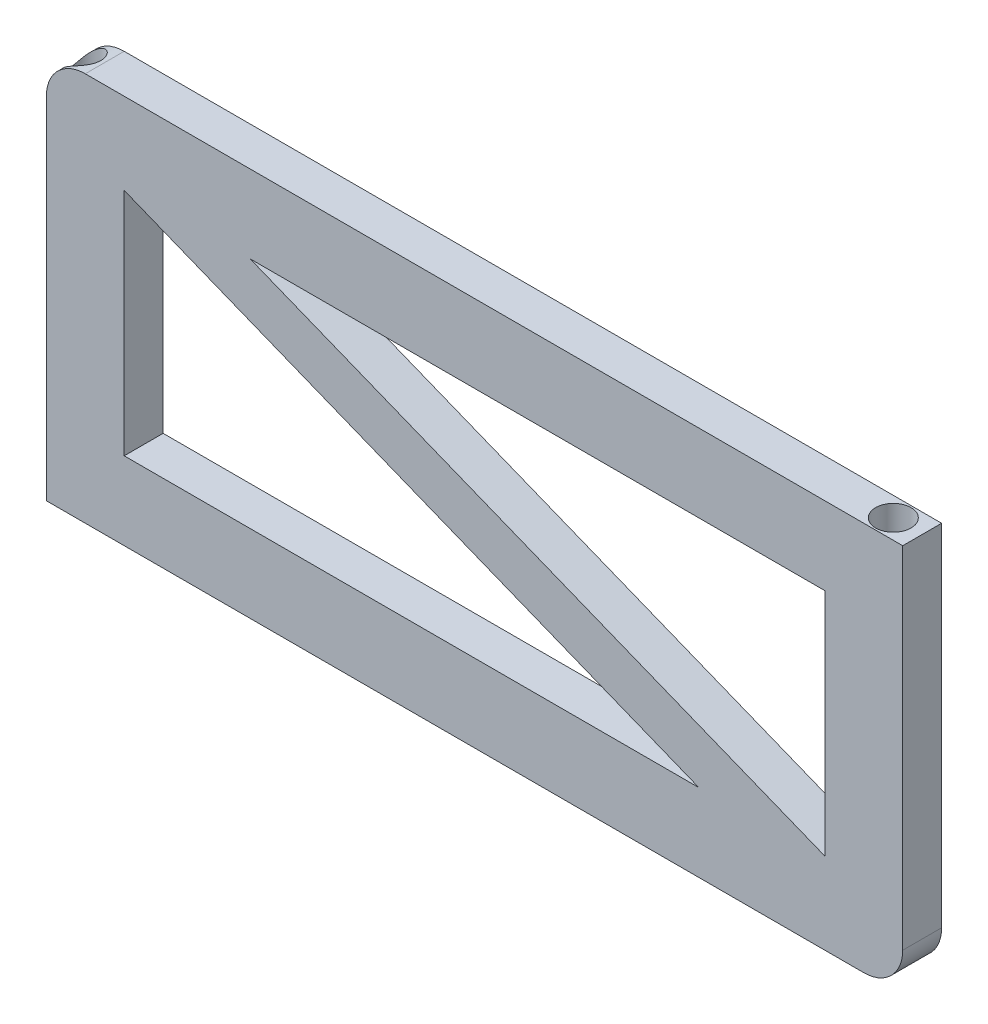
ISO-10303-21;
HEADER;
FILE_DESCRIPTION(('STEP AP214'),'2;1');
FILE_NAME('part.step','',(''),(''),'','','');
FILE_SCHEMA(('AUTOMOTIVE_DESIGN { 1 0 10303 214 1 1 1 1 }'));
ENDSEC;
DATA;
#1=APPLICATION_CONTEXT('core data for automotive mechanical design processes');
#2=APPLICATION_PROTOCOL_DEFINITION('international standard','automotive_design',2000,#1);
#3=PRODUCT_CONTEXT('',#1,'mechanical');
#4=PRODUCT('Part','Part','',(#3));
#5=PRODUCT_RELATED_PRODUCT_CATEGORY('part','',(#4));
#6=PRODUCT_DEFINITION_FORMATION('','',#4);
#7=PRODUCT_DEFINITION_CONTEXT('part definition',#1,'design');
#8=PRODUCT_DEFINITION('design','',#6,#7);
#9=PRODUCT_DEFINITION_SHAPE('','',#8);
#10=(LENGTH_UNIT() NAMED_UNIT(*) SI_UNIT(.MILLI.,.METRE.));
#11=(NAMED_UNIT(*) PLANE_ANGLE_UNIT() SI_UNIT($,.RADIAN.));
#12=(NAMED_UNIT(*) SI_UNIT($,.STERADIAN.) SOLID_ANGLE_UNIT());
#13=UNCERTAINTY_MEASURE_WITH_UNIT(LENGTH_MEASURE(1.E-05),#10,'distance_accuracy_value','');
#14=(GEOMETRIC_REPRESENTATION_CONTEXT(3) GLOBAL_UNCERTAINTY_ASSIGNED_CONTEXT((#13)) GLOBAL_UNIT_ASSIGNED_CONTEXT((#10,
#11,#12)) REPRESENTATION_CONTEXT('',''));
#15=CARTESIAN_POINT('',(0.,0.,0.));
#16=DIRECTION('',(0.,0.,1.));
#17=DIRECTION('',(1.,0.,0.));
#18=AXIS2_PLACEMENT_3D('',#15,#16,#17);
#19=CARTESIAN_POINT('',(200.,0.,10.));
#20=DIRECTION('',(0.,0.,1.));
#21=DIRECTION('',(1.,0.,0.));
#22=AXIS2_PLACEMENT_3D('',#19,#20,#21);
#23=PLANE('',#22);
#24=DIRECTION('',(-1.,0.,0.));
#25=VECTOR('',#24,1.);
#26=CARTESIAN_POINT('',(42.3606797749979,70.,10.));
#27=LINE('',#26,#25);
#28=CARTESIAN_POINT('',(190.,70.,10.));
#29=VERTEX_POINT('',#28);
#30=CARTESIAN_POINT('',(42.3606797749979,70.,10.));
#31=VERTEX_POINT('',#30);
#32=EDGE_CURVE('E168',#29,#31,#27,.T.);
#33=ORIENTED_EDGE('',*,*,#32,.F.);
#34=DIRECTION('',(0.,1.,0.));
#35=VECTOR('',#34,1.);
#36=CARTESIAN_POINT('',(190.,10.9442719099992,10.));
#37=LINE('',#36,#35);
#38=CARTESIAN_POINT('',(190.,10.9442719099992,10.));
#39=VERTEX_POINT('',#38);
#40=EDGE_CURVE('E166',#39,#29,#37,.T.);
#41=ORIENTED_EDGE('',*,*,#40,.F.);
#42=DIRECTION('',(0.928476690885259,-0.371390676354104,0.));
#43=VECTOR('',#42,1.);
#44=CARTESIAN_POINT('',(42.3606797749979,70.,10.));
#45=LINE('',#44,#43);
#46=EDGE_CURVE('E172',#31,#39,#45,.T.);
#47=ORIENTED_EDGE('',*,*,#46,.F.);
#48=EDGE_LOOP('',(#33,#41,#47));
#49=FACE_BOUND('',#48,.T.);
#50=DIRECTION('',(1.,0.,0.));
#51=VECTOR('',#50,1.);
#52=CARTESIAN_POINT('',(-10.,-10.,10.));
#53=LINE('',#52,#51);
#54=CARTESIAN_POINT('',(-10.,-10.,10.));
#55=VERTEX_POINT('',#54);
#56=CARTESIAN_POINT('',(200.,-10.,10.));
#57=VERTEX_POINT('',#56);
#58=EDGE_CURVE('E190',#55,#57,#53,.T.);
#59=ORIENTED_EDGE('',*,*,#58,.T.);
#60=CARTESIAN_POINT('',(200.,0.,10.));
#61=DIRECTION('',(0.,0.,1.));
#62=DIRECTION('',(1.,0.,0.));
#63=AXIS2_PLACEMENT_3D('',#60,#61,#62);
#64=CIRCLE('',#63,10.);
#65=CARTESIAN_POINT('',(210.,0.,10.));
#66=VERTEX_POINT('',#65);
#67=EDGE_CURVE('E193',#57,#66,#64,.T.);
#68=ORIENTED_EDGE('',*,*,#67,.T.);
#69=DIRECTION('',(0.,1.,0.));
#70=VECTOR('',#69,1.);
#71=CARTESIAN_POINT('',(210.,0.,10.));
#72=LINE('',#71,#70);
#73=CARTESIAN_POINT('',(210.,90.,10.));
#74=VERTEX_POINT('',#73);
#75=EDGE_CURVE('E196',#66,#74,#72,.T.);
#76=ORIENTED_EDGE('',*,*,#75,.T.);
#77=DIRECTION('',(-1.,0.,0.));
#78=VECTOR('',#77,1.);
#79=CARTESIAN_POINT('',(0.,90.,10.));
#80=LINE('',#79,#78);
#81=CARTESIAN_POINT('',(0.,90.,10.));
#82=VERTEX_POINT('',#81);
#83=EDGE_CURVE('E198',#74,#82,#80,.T.);
#84=ORIENTED_EDGE('',*,*,#83,.T.);
#85=CARTESIAN_POINT('',(0.,80.,10.));
#86=DIRECTION('',(0.,0.,1.));
#87=DIRECTION('',(-1.,0.,0.));
#88=AXIS2_PLACEMENT_3D('',#85,#86,#87);
#89=CIRCLE('',#88,10.);
#90=CARTESIAN_POINT('',(-10.,80.,10.));
#91=VERTEX_POINT('',#90);
#92=EDGE_CURVE('E200',#82,#91,#89,.T.);
#93=ORIENTED_EDGE('',*,*,#92,.T.);
#94=DIRECTION('',(0.,-1.,0.));
#95=VECTOR('',#94,1.);
#96=CARTESIAN_POINT('',(-10.,-10.,10.));
#97=LINE('',#96,#95);
#98=EDGE_CURVE('E202',#91,#55,#97,.T.);
#99=ORIENTED_EDGE('',*,*,#98,.T.);
#100=EDGE_LOOP('',(#59,#68,#76,#84,#93,#99));
#101=FACE_BOUND('',#100,.T.);
#102=DIRECTION('',(0.,-1.,0.));
#103=VECTOR('',#102,1.);
#104=CARTESIAN_POINT('',(10.,10.,10.));
#105=LINE('',#104,#103);
#106=CARTESIAN_POINT('',(10.,69.0557280900009,10.));
#107=VERTEX_POINT('',#106);
#108=CARTESIAN_POINT('',(10.,10.,10.));
#109=VERTEX_POINT('',#108);
#110=EDGE_CURVE('E149',#107,#109,#105,.T.);
#111=ORIENTED_EDGE('',*,*,#110,.F.);
#112=DIRECTION('',(-0.928476690885259,0.371390676354104,0.));
#113=VECTOR('',#112,1.);
#114=CARTESIAN_POINT('',(10.,69.0557280900009,10.));
#115=LINE('',#114,#113);
#116=CARTESIAN_POINT('',(157.639320225002,10.,10.));
#117=VERTEX_POINT('',#116);
#118=EDGE_CURVE('E147',#117,#107,#115,.T.);
#119=ORIENTED_EDGE('',*,*,#118,.F.);
#120=DIRECTION('',(1.,0.,0.));
#121=VECTOR('',#120,1.);
#122=CARTESIAN_POINT('',(10.,10.,10.));
#123=LINE('',#122,#121);
#124=EDGE_CURVE('E152',#109,#117,#123,.T.);
#125=ORIENTED_EDGE('',*,*,#124,.F.);
#126=EDGE_LOOP('',(#111,#119,#125));
#127=FACE_BOUND('',#126,.T.);
#128=ADVANCED_FACE('F32',(#49,#101,#127),#23,.T.);
#129=CARTESIAN_POINT('',(200.,0.,0.));
#130=DIRECTION('',(0.,0.,1.));
#131=DIRECTION('',(1.,0.,0.));
#132=AXIS2_PLACEMENT_3D('',#129,#130,#131);
#133=PLANE('',#132);
#134=DIRECTION('',(0.,1.,0.));
#135=VECTOR('',#134,1.);
#136=CARTESIAN_POINT('',(190.,10.9442719099992,0.));
#137=LINE('',#136,#135);
#138=CARTESIAN_POINT('',(190.,10.9442719099991,0.));
#139=VERTEX_POINT('',#138);
#140=CARTESIAN_POINT('',(190.,70.,0.));
#141=VERTEX_POINT('',#140);
#142=EDGE_CURVE('E165',#139,#141,#137,.T.);
#143=ORIENTED_EDGE('',*,*,#142,.T.);
#144=DIRECTION('',(-1.,0.,0.));
#145=VECTOR('',#144,1.);
#146=CARTESIAN_POINT('',(42.3606797749979,70.,0.));
#147=LINE('',#146,#145);
#148=CARTESIAN_POINT('',(42.3606797749979,70.,0.));
#149=VERTEX_POINT('',#148);
#150=EDGE_CURVE('E177',#141,#149,#147,.T.);
#151=ORIENTED_EDGE('',*,*,#150,.T.);
#152=DIRECTION('',(0.928476690885259,-0.371390676354104,0.));
#153=VECTOR('',#152,1.);
#154=CARTESIAN_POINT('',(42.3606797749979,70.,0.));
#155=LINE('',#154,#153);
#156=EDGE_CURVE('E169',#149,#139,#155,.T.);
#157=ORIENTED_EDGE('',*,*,#156,.T.);
#158=EDGE_LOOP('',(#143,#151,#157));
#159=FACE_BOUND('',#158,.T.);
#160=DIRECTION('',(1.,0.,0.));
#161=VECTOR('',#160,1.);
#162=CARTESIAN_POINT('',(-10.,-10.,0.));
#163=LINE('',#162,#161);
#164=CARTESIAN_POINT('',(-10.,-10.,0.));
#165=VERTEX_POINT('',#164);
#166=CARTESIAN_POINT('',(200.,-10.,0.));
#167=VERTEX_POINT('',#166);
#168=EDGE_CURVE('E189',#165,#167,#163,.T.);
#169=ORIENTED_EDGE('',*,*,#168,.F.);
#170=DIRECTION('',(0.,-1.,0.));
#171=VECTOR('',#170,1.);
#172=CARTESIAN_POINT('',(-10.,-10.,0.));
#173=LINE('',#172,#171);
#174=CARTESIAN_POINT('',(-10.,80.,0.));
#175=VERTEX_POINT('',#174);
#176=EDGE_CURVE('E194',#175,#165,#173,.T.);
#177=ORIENTED_EDGE('',*,*,#176,.F.);
#178=CARTESIAN_POINT('',(0.,80.,0.));
#179=DIRECTION('',(0.,0.,1.));
#180=DIRECTION('',(-1.,0.,0.));
#181=AXIS2_PLACEMENT_3D('',#178,#179,#180);
#182=CIRCLE('',#181,10.);
#183=CARTESIAN_POINT('',(0.,90.,0.));
#184=VERTEX_POINT('',#183);
#185=EDGE_CURVE('E213',#184,#175,#182,.T.);
#186=ORIENTED_EDGE('',*,*,#185,.F.);
#187=DIRECTION('',(-1.,0.,0.));
#188=VECTOR('',#187,1.);
#189=CARTESIAN_POINT('',(0.,90.,0.));
#190=LINE('',#189,#188);
#191=CARTESIAN_POINT('',(210.,90.,0.));
#192=VERTEX_POINT('',#191);
#193=EDGE_CURVE('E211',#192,#184,#190,.T.);
#194=ORIENTED_EDGE('',*,*,#193,.F.);
#195=DIRECTION('',(0.,1.,0.));
#196=VECTOR('',#195,1.);
#197=CARTESIAN_POINT('',(210.,0.,0.));
#198=LINE('',#197,#196);
#199=CARTESIAN_POINT('',(210.,0.,0.));
#200=VERTEX_POINT('',#199);
#201=EDGE_CURVE('E209',#200,#192,#198,.T.);
#202=ORIENTED_EDGE('',*,*,#201,.F.);
#203=CARTESIAN_POINT('',(200.,0.,0.));
#204=DIRECTION('',(0.,0.,1.));
#205=DIRECTION('',(1.,0.,0.));
#206=AXIS2_PLACEMENT_3D('',#203,#204,#205);
#207=CIRCLE('',#206,10.);
#208=EDGE_CURVE('E207',#167,#200,#207,.T.);
#209=ORIENTED_EDGE('',*,*,#208,.F.);
#210=EDGE_LOOP('',(#169,#177,#186,#194,#202,#209));
#211=FACE_BOUND('',#210,.T.);
#212=DIRECTION('',(-0.928476690885259,0.371390676354104,0.));
#213=VECTOR('',#212,1.);
#214=CARTESIAN_POINT('',(10.,69.0557280900009,0.));
#215=LINE('',#214,#213);
#216=CARTESIAN_POINT('',(157.639320225002,10.,0.));
#217=VERTEX_POINT('',#216);
#218=CARTESIAN_POINT('',(10.,69.0557280900009,0.));
#219=VERTEX_POINT('',#218);
#220=EDGE_CURVE('E60',#217,#219,#215,.T.);
#221=ORIENTED_EDGE('',*,*,#220,.T.);
#222=DIRECTION('',(0.,-1.,0.));
#223=VECTOR('',#222,1.);
#224=CARTESIAN_POINT('',(10.,10.,0.));
#225=LINE('',#224,#223);
#226=CARTESIAN_POINT('',(10.,10.,0.));
#227=VERTEX_POINT('',#226);
#228=EDGE_CURVE('E156',#219,#227,#225,.T.);
#229=ORIENTED_EDGE('',*,*,#228,.T.);
#230=DIRECTION('',(1.,0.,0.));
#231=VECTOR('',#230,1.);
#232=CARTESIAN_POINT('',(10.,10.,0.));
#233=LINE('',#232,#231);
#234=EDGE_CURVE('E150',#227,#217,#233,.T.);
#235=ORIENTED_EDGE('',*,*,#234,.T.);
#236=EDGE_LOOP('',(#221,#229,#235));
#237=FACE_BOUND('',#236,.T.);
#238=ADVANCED_FACE('F238',(#159,#211,#237),#133,.F.);
#239=CARTESIAN_POINT('',(-10.,-10.,10.));
#240=DIRECTION('',(0.,1.,0.));
#241=DIRECTION('',(0.,0.,1.));
#242=AXIS2_PLACEMENT_3D('',#239,#240,#241);
#243=PLANE('',#242);
#244=CARTESIAN_POINT('',(-5.,-10.,5.));
#245=DIRECTION('',(0.,-1.,0.));
#246=DIRECTION('',(0.,0.,-1.));
#247=AXIS2_PLACEMENT_3D('',#244,#245,#246);
#248=CIRCLE('',#247,3.99999999999999);
#249=CARTESIAN_POINT('',(-5.,-10.,1.00000000000001));
#250=VERTEX_POINT('',#249);
#251=EDGE_CURVE('E139',#250,#250,#248,.T.);
#252=ORIENTED_EDGE('',*,*,#251,.F.);
#253=EDGE_LOOP('',(#252));
#254=FACE_BOUND('',#253,.T.);
#255=ORIENTED_EDGE('',*,*,#168,.T.);
#256=DIRECTION('',(0.,0.,-1.));
#257=VECTOR('',#256,1.);
#258=CARTESIAN_POINT('',(200.,-10.,10.));
#259=LINE('',#258,#257);
#260=EDGE_CURVE('E11',#57,#167,#259,.T.);
#261=ORIENTED_EDGE('',*,*,#260,.F.);
#262=ORIENTED_EDGE('',*,*,#58,.F.);
#263=DIRECTION('',(0.,0.,-1.));
#264=VECTOR('',#263,1.);
#265=CARTESIAN_POINT('',(-10.,-10.,10.));
#266=LINE('',#265,#264);
#267=EDGE_CURVE('E204',#55,#165,#266,.T.);
#268=ORIENTED_EDGE('',*,*,#267,.T.);
#269=EDGE_LOOP('',(#255,#261,#262,#268));
#270=FACE_BOUND('',#269,.T.);
#271=ADVANCED_FACE('F34',(#254,#270),#243,.F.);
#272=CARTESIAN_POINT('',(200.,0.,10.));
#273=DIRECTION('',(0.,0.,-1.));
#274=DIRECTION('',(-1.,0.,0.));
#275=AXIS2_PLACEMENT_3D('',#272,#273,#274);
#276=CYLINDRICAL_SURFACE('',#275,10.);
#277=ORIENTED_EDGE('',*,*,#208,.T.);
#278=DIRECTION('',(0.,0.,-1.));
#279=VECTOR('',#278,1.);
#280=CARTESIAN_POINT('',(210.,0.,10.));
#281=LINE('',#280,#279);
#282=EDGE_CURVE('E45',#66,#200,#281,.T.);
#283=ORIENTED_EDGE('',*,*,#282,.F.);
#284=ORIENTED_EDGE('',*,*,#67,.F.);
#285=ORIENTED_EDGE('',*,*,#260,.T.);
#286=EDGE_LOOP('',(#277,#283,#284,#285));
#287=FACE_BOUND('',#286,.T.);
#288=ADVANCED_FACE('F256',(#287),#276,.T.);
#289=CARTESIAN_POINT('',(210.,0.,10.));
#290=DIRECTION('',(-1.,0.,0.));
#291=DIRECTION('',(0.,-1.,0.));
#292=AXIS2_PLACEMENT_3D('',#289,#290,#291);
#293=PLANE('',#292);
#294=ORIENTED_EDGE('',*,*,#201,.T.);
#295=DIRECTION('',(0.,0.,-1.));
#296=VECTOR('',#295,1.);
#297=CARTESIAN_POINT('',(210.,90.,10.));
#298=LINE('',#297,#296);
#299=EDGE_CURVE('E224',#74,#192,#298,.T.);
#300=ORIENTED_EDGE('',*,*,#299,.F.);
#301=ORIENTED_EDGE('',*,*,#75,.F.);
#302=ORIENTED_EDGE('',*,*,#282,.T.);
#303=EDGE_LOOP('',(#294,#300,#301,#302));
#304=FACE_BOUND('',#303,.T.);
#305=ADVANCED_FACE('F232',(#304),#293,.F.);
#306=CARTESIAN_POINT('',(0.,90.,10.));
#307=DIRECTION('',(0.,-1.,0.));
#308=DIRECTION('',(0.,0.,-1.));
#309=AXIS2_PLACEMENT_3D('',#306,#307,#308);
#310=PLANE('',#309);
#311=CARTESIAN_POINT('',(202.585893874385,90.,5.));
#312=DIRECTION('',(0.,1.,0.));
#313=DIRECTION('',(0.,0.,1.));
#314=AXIS2_PLACEMENT_3D('',#311,#312,#313);
#315=CIRCLE('',#314,4.54659999999998);
#316=CARTESIAN_POINT('',(202.585893874385,90.,9.54659999999998));
#317=VERTEX_POINT('',#316);
#318=EDGE_CURVE('E140',#317,#317,#315,.T.);
#319=ORIENTED_EDGE('',*,*,#318,.F.);
#320=EDGE_LOOP('',(#319));
#321=FACE_BOUND('',#320,.T.);
#322=ORIENTED_EDGE('',*,*,#193,.T.);
#323=DIRECTION('',(0.,0.,-1.));
#324=VECTOR('',#323,1.);
#325=CARTESIAN_POINT('',(0.,90.,10.));
#326=LINE('',#325,#324);
#327=EDGE_CURVE('E221',#82,#184,#326,.T.);
#328=ORIENTED_EDGE('',*,*,#327,.F.);
#329=ORIENTED_EDGE('',*,*,#83,.F.);
#330=ORIENTED_EDGE('',*,*,#299,.T.);
#331=EDGE_LOOP('',(#322,#328,#329,#330));
#332=FACE_BOUND('',#331,.T.);
#333=ADVANCED_FACE('F244',(#321,#332),#310,.F.);
#334=CARTESIAN_POINT('',(0.,80.,10.));
#335=DIRECTION('',(0.,0.,-1.));
#336=DIRECTION('',(-1.,0.,0.));
#337=AXIS2_PLACEMENT_3D('',#334,#335,#336);
#338=CYLINDRICAL_SURFACE('',#337,10.);
#339=CARTESIAN_POINT('',(-5.,88.6602540378444,1.00000000000002));
#340=CARTESIAN_POINT('',(-4.89768345839902,88.7193265425948,1.00000006398469));
#341=CARTESIAN_POINT('',(-4.79431481015427,88.7765848292967,1.00392721835651));
#342=CARTESIAN_POINT('',(-4.58612560333258,88.887144608448,1.02009974257708));
#343=CARTESIAN_POINT('',(-4.48130522205249,88.9404465791041,1.03234410528819));
#344=CARTESIAN_POINT('',(-4.27085734509868,89.0428693112057,1.06557377979914));
#345=CARTESIAN_POINT('',(-4.16522911203817,89.0919855834563,1.08656833761139));
#346=CARTESIAN_POINT('',(-3.95421630056543,89.185722319771,1.13760280314264));
#347=CARTESIAN_POINT('',(-3.84883162953814,89.2303449304304,1.16763836441176));
#348=CARTESIAN_POINT('',(-3.63872824880705,89.3151787174552,1.23712333018676));
#349=CARTESIAN_POINT('',(-3.53401537029663,89.35536709893,1.27661834345089));
#350=CARTESIAN_POINT('',(-3.32690278125528,89.4310056781606,1.36497387007106));
#351=CARTESIAN_POINT('',(-3.22450214830285,89.466457794126,1.41383057226418));
#352=CARTESIAN_POINT('',(-3.02309238322172,89.5326885701006,1.52079943032009));
#353=CARTESIAN_POINT('',(-2.92408284824926,89.5634677867262,1.57891048215099));
#354=CARTESIAN_POINT('',(-2.73054756245629,89.620513940719,1.70411377479525));
#355=CARTESIAN_POINT('',(-2.63602151560338,89.646781176301,1.77120542152348));
#356=CARTESIAN_POINT('',(-2.45938656769321,89.6932515595153,1.90858464982312));
#357=CARTESIAN_POINT('',(-2.37687799883929,89.7137616506078,1.97825583145609));
#358=CARTESIAN_POINT('',(-2.21733883773976,89.7514167883681,2.12449833757996));
#359=CARTESIAN_POINT('',(-2.14031008422974,89.7685607088921,2.20107195880644));
#360=CARTESIAN_POINT('',(-1.99249297038088,89.7997795117004,2.36054592833491));
#361=CARTESIAN_POINT('',(-1.9217023087126,89.8138555286298,2.44344392224097));
#362=CARTESIAN_POINT('',(-1.78692446424945,89.8392889389108,2.61503577310051));
#363=CARTESIAN_POINT('',(-1.72293984284615,89.8506453107467,2.70373179195553));
#364=CARTESIAN_POINT('',(-1.60308912051756,89.8708539171286,2.88513314149346));
#365=CARTESIAN_POINT('',(-1.54713224446236,89.8797354376827,2.97777517226817));
#366=CARTESIAN_POINT('',(-1.4428367460816,89.8955037626446,3.1674271338096));
#367=CARTESIAN_POINT('',(-1.39450087776403,89.9023898467101,3.26443862736405));
#368=CARTESIAN_POINT('',(-1.261551274082,89.9205129038113,3.56096884036672));
#369=CARTESIAN_POINT('',(-1.18887718859739,89.9292331467668,3.76616254027999));
#370=CARTESIAN_POINT('',(-1.07664045868027,89.942038381458,4.18986962806666));
#371=CARTESIAN_POINT('',(-1.03777276536323,89.9460266746476,4.40856784841051));
#372=CARTESIAN_POINT('',(-0.996709884735306,89.950226249007,4.84945280886822));
#373=CARTESIAN_POINT('',(-0.994517519492787,89.9504372395236,5.07163981611823));
#374=CARTESIAN_POINT('',(-1.02705473041462,89.9471315977295,5.51546790546121));
#375=CARTESIAN_POINT('',(-1.06214765763186,89.9435782826588,5.7370821252918));
#376=CARTESIAN_POINT('',(-1.16879089079864,89.9316050684668,6.17123759672837));
#377=CARTESIAN_POINT('',(-1.24034226657613,89.9231850265364,6.38377858189318));
#378=CARTESIAN_POINT('',(-1.41755218159705,89.8994181651711,6.79324617037567));
#379=CARTESIAN_POINT('',(-1.52314478360837,89.8840847141823,6.99020205058042));
#380=CARTESIAN_POINT('',(-1.76504496503376,89.8437587614133,7.36314185462891));
#381=CARTESIAN_POINT('',(-1.90134757954086,89.8187678204991,7.53912916145164));
#382=CARTESIAN_POINT('',(-2.1975377010009,89.7567052829188,7.86243144693031));
#383=CARTESIAN_POINT('',(-2.35702512657431,89.7198277579896,8.01015004122623));
#384=CARTESIAN_POINT('',(-2.69519539687367,89.6315305358646,8.27630191980002));
#385=CARTESIAN_POINT('',(-2.87387389901112,89.5801141242709,8.39474180936844));
#386=CARTESIAN_POINT('',(-3.24071553690992,89.462254592162,8.59836872972402));
#387=CARTESIAN_POINT('',(-3.42868670052409,89.3960589846543,8.68404671862021));
#388=CARTESIAN_POINT('',(-3.80994696118321,89.2480334506406,8.82427239950507));
#389=CARTESIAN_POINT('',(-4.00323676131292,89.166201448536,8.87881595482534));
#390=CARTESIAN_POINT('',(-4.3966203592239,88.9843487040845,8.95952601162096));
#391=CARTESIAN_POINT('',(-4.59668361963808,88.8837403752379,8.98449539160314));
#392=CARTESIAN_POINT('',(-4.9906889460099,88.6685326205598,9.00485618740898));
#393=CARTESIAN_POINT('',(-5.1846280790216,88.5539266151696,9.00023364075859));
#394=CARTESIAN_POINT('',(-5.50501231717108,88.3498048837753,8.9701927739431));
#395=CARTESIAN_POINT('',(-5.63406044618618,88.263246137399,8.95151985684016));
#396=CARTESIAN_POINT('',(-5.88657812881372,88.0852977369572,8.90262925824727));
#397=CARTESIAN_POINT('',(-6.01004591889087,87.9939065752477,8.87240795529694));
#398=CARTESIAN_POINT('',(-6.25098647171994,87.8069505169755,8.80142632820104));
#399=CARTESIAN_POINT('',(-6.36844741875479,87.7113780324069,8.76064612216112));
#400=CARTESIAN_POINT('',(-6.5967891766362,87.5169718463143,8.66952022423705));
#401=CARTESIAN_POINT('',(-6.70766854956909,87.4181374394252,8.61917245209363));
#402=CARTESIAN_POINT('',(-6.94934994469082,87.1930628674541,8.49610112814079));
#403=CARTESIAN_POINT('',(-7.07825162981681,87.0661181274685,8.42092658965647));
#404=CARTESIAN_POINT('',(-7.32526471388815,86.8097139898009,8.2580736214794));
#405=CARTESIAN_POINT('',(-7.44337190533258,86.6802536352175,8.17039034992028));
#406=CARTESIAN_POINT('',(-7.66863216082082,86.4204079170466,7.98326014606864));
#407=CARTESIAN_POINT('',(-7.77578813212953,86.2900228088382,7.88381635109168));
#408=CARTESIAN_POINT('',(-7.97904490550103,86.0300922891676,7.67333190367402));
#409=CARTESIAN_POINT('',(-8.07515118248315,85.9005464921306,7.56229704687926));
#410=CARTESIAN_POINT('',(-8.21875128102571,85.6974226706072,7.37638060132135));
#411=CARTESIAN_POINT('',(-8.26994798979431,85.6227954352231,7.30547303859138));
#412=CARTESIAN_POINT('',(-8.36832908239128,85.4753006211283,7.15919688357882));
#413=CARTESIAN_POINT('',(-8.41551427289412,85.40243269076,7.08382919337603));
#414=CARTESIAN_POINT('',(-8.50564557688892,85.2593846664656,6.92834557090925));
#415=CARTESIAN_POINT('',(-8.54859680046737,85.1892013965754,6.84823555401522));
#416=CARTESIAN_POINT('',(-8.63001430629128,85.0526402569028,6.68270519742947));
#417=CARTESIAN_POINT('',(-8.66848230551725,84.9862609352717,6.59728691003744));
#418=CARTESIAN_POINT('',(-8.75020601285912,84.8417433752682,6.39666331436335));
#419=CARTESIAN_POINT('',(-8.7919634639315,84.7652491290658,6.27962886116414));
#420=CARTESIAN_POINT('',(-8.86596201084152,84.6261122179685,6.03471286413447));
#421=CARTESIAN_POINT('',(-8.89821927879003,84.5634460597431,5.90685023654391));
#422=CARTESIAN_POINT('',(-8.94394619348302,84.4729988451252,5.67482582085354));
#423=CARTESIAN_POINT('',(-8.96011912677026,84.4403849311621,5.57312628971117));
#424=CARTESIAN_POINT('',(-8.98466666901236,84.3905075870837,5.36515875289961));
#425=CARTESIAN_POINT('',(-8.99305563971533,84.3732158894816,5.25889954071307));
#426=CARTESIAN_POINT('',(-9.00121085372495,84.3564103115088,5.04392612294818));
#427=CARTESIAN_POINT('',(-9.0009237883666,84.357006339558,4.93520084320366));
#428=CARTESIAN_POINT('',(-8.99162948141787,84.3761504088449,4.71970162961208));
#429=CARTESIAN_POINT('',(-8.9826131857296,84.3947170895267,4.61292983912261));
#430=CARTESIAN_POINT('',(-8.95388424567056,84.4529996651417,4.38080135612957));
#431=CARTESIAN_POINT('',(-8.93221952626961,84.496537753503,4.25667658846997));
#432=CARTESIAN_POINT('',(-8.87941922511639,84.5999189644343,4.01754807263178));
#433=CARTESIAN_POINT('',(-8.84825810196173,84.6598060131233,3.9025699900989));
#434=CARTESIAN_POINT('',(-8.78241485643072,84.7826217913586,3.69471858082948));
#435=CARTESIAN_POINT('',(-8.74858787974071,84.8443486034123,3.60084054964169));
#436=CARTESIAN_POINT('',(-8.67572340778995,84.9736642399426,3.41929335779161));
#437=CARTESIAN_POINT('',(-8.63668180207723,85.0412576739354,3.33162917953096));
#438=CARTESIAN_POINT('',(-8.55382468795472,85.1806054962497,3.16171765072143));
#439=CARTESIAN_POINT('',(-8.50999852153077,85.2523690004432,3.07948307647688));
#440=CARTESIAN_POINT('',(-8.41795051028242,85.3986657658604,2.920076670818));
#441=CARTESIAN_POINT('',(-8.36972729631279,85.4731998854851,2.84290642927886));
#442=CARTESIAN_POINT('',(-8.23559975913153,85.6742984214137,2.64341641893102));
#443=CARTESIAN_POINT('',(-8.14597105638933,85.8024878080959,2.52521630837015));
#444=CARTESIAN_POINT('',(-7.95552128437073,86.0609832045544,2.3006372698755));
#445=CARTESIAN_POINT('',(-7.85469346435503,86.1912904501197,2.19426555015162));
#446=CARTESIAN_POINT('',(-7.64203762988467,86.4519419448482,1.99316640491924));
#447=CARTESIAN_POINT('',(-7.53020891859177,86.5822861958334,1.89843971790743));
#448=CARTESIAN_POINT('',(-7.29567946507664,86.8413136805619,1.72105863105677));
#449=CARTESIAN_POINT('',(-7.17298322520834,86.9699975770994,1.63839926903526));
#450=CARTESIAN_POINT('',(-6.93887423910573,87.202385406451,1.49914571346128));
#451=CARTESIAN_POINT('',(-6.82915418811487,87.3065766559973,1.44051398316887));
#452=CARTESIAN_POINT('',(-6.6024547353368,87.5120562676624,1.33286438592951));
#453=CARTESIAN_POINT('',(-6.48547452159246,87.6133443032351,1.28384759685153));
#454=CARTESIAN_POINT('',(-6.24497181763977,87.8118213776848,1.19653386320614));
#455=CARTESIAN_POINT('',(-6.12147336359826,87.9090233862563,1.15820041556277));
#456=CARTESIAN_POINT('',(-5.86809680000963,88.0987936830604,1.0931474059995));
#457=CARTESIAN_POINT('',(-5.73822274828192,88.1913648447915,1.06642056091665));
#458=CARTESIAN_POINT('',(-5.50745174387855,88.3475753758111,1.03107849530992));
#459=CARTESIAN_POINT('',(-5.4078362368181,88.4124612423325,1.01955708780593));
#460=CARTESIAN_POINT('',(-5.20584036396629,88.5389360160162,1.00401507515005));
#461=CARTESIAN_POINT('',(-5.10345803863573,88.6005224892292,0.9999999353015));
#462=CARTESIAN_POINT('',(-5.,88.6602540378444,1.00000000000002));
#463=B_SPLINE_CURVE_WITH_KNOTS('',3,(#339,#340,#341,#342,#343,#344,#345,#346,#347,#348,#349,
#350,#351,#352,#353,#354,#355,#356,#357,#358,#359,#360,#361,#362,#363,#364,#365,#366,#367,#368,
#369,#370,#371,#372,#373,#374,#375,#376,#377,#378,#379,#380,#381,#382,#383,#384,#385,#386,#387,
#388,#389,#390,#391,#392,#393,#394,#395,#396,#397,#398,#399,#400,#401,#402,#403,#404,#405,#406,
#407,#408,#409,#410,#411,#412,#413,#414,#415,#416,#417,#418,#419,#420,#421,#422,#423,#424,#425,
#426,#427,#428,#429,#430,#431,#432,#433,#434,#435,#436,#437,#438,#439,#440,#441,#442,#443,#444,
#445,#446,#447,#448,#449,#450,#451,#452,#453,#454,#455,#456,#457,#458,#459,#460,#461,#462),
.UNSPECIFIED.,.T.,.F.,(4,2,2,2,2,2,2,2,2,2,2,2,2,2,2,2,2,2,2,2,2,2,2,2,2,2,2,2,2,2,2,2,2,2,2,2,
2,2,2,2,2,2,2,2,2,2,2,2,2,2,2,2,2,2,2,2,2,2,2,2,2,4),(0.,0.354348888202905,0.70865487565257,
1.06333619832481,1.41784728003497,1.77410332228216,2.13021463891325,2.4862835037075,
2.84232882543184,3.17168916474285,3.50115950368472,3.83050778252263,4.15997957330812,
4.48536875094026,4.81087524646894,5.46124935218354,6.12469688157123,6.78819546123631,
7.45821975939914,8.12826371972645,8.79701753752486,9.46566331495622,10.1239025675685,
10.7819931852724,11.4297944965945,12.0776818578472,12.7509847992334,13.4246054511778,
13.8935512771258,14.3626442807212,14.8326270694054,15.3027121627942,15.8896676882873,
16.4768510314575,17.0638780855318,17.650613013521,17.9953835575572,18.3400846070343,
18.6843643987874,19.0285119023076,19.4652906140653,19.9013214441985,20.2241785290807,
20.5464387372215,20.8706794274575,21.1952567860378,21.5929543609051,21.9917311619775,
22.3432406642751,22.6950288988026,23.0476174094863,23.4003160859702,23.98766660682,
24.57537311932,25.1631168833829,25.750618277503,26.2370008688094,26.7234379542049,
27.2081920036791,27.6926414280695,28.0506830302043,28.4089852205695),.UNSPECIFIED.);
#464=CARTESIAN_POINT('',(-5.,88.6602540378444,1.00000000000002));
#465=VERTEX_POINT('',#464);
#466=EDGE_CURVE('E36',#465,#465,#463,.T.);
#467=ORIENTED_EDGE('',*,*,#466,.T.);
#468=EDGE_LOOP('',(#467));
#469=FACE_BOUND('',#468,.T.);
#470=ORIENTED_EDGE('',*,*,#185,.T.);
#471=DIRECTION('',(0.,0.,-1.));
#472=VECTOR('',#471,1.);
#473=CARTESIAN_POINT('',(-10.,80.,10.));
#474=LINE('',#473,#472);
#475=EDGE_CURVE('E218',#91,#175,#474,.T.);
#476=ORIENTED_EDGE('',*,*,#475,.F.);
#477=ORIENTED_EDGE('',*,*,#92,.F.);
#478=ORIENTED_EDGE('',*,*,#327,.T.);
#479=EDGE_LOOP('',(#470,#476,#477,#478));
#480=FACE_BOUND('',#479,.T.);
#481=ADVANCED_FACE('F248',(#469,#480),#338,.T.);
#482=CARTESIAN_POINT('',(-10.,-10.,10.));
#483=DIRECTION('',(1.,0.,0.));
#484=DIRECTION('',(0.,0.,-1.));
#485=AXIS2_PLACEMENT_3D('',#482,#483,#484);
#486=PLANE('',#485);
#487=ORIENTED_EDGE('',*,*,#176,.T.);
#488=ORIENTED_EDGE('',*,*,#267,.F.);
#489=ORIENTED_EDGE('',*,*,#98,.F.);
#490=ORIENTED_EDGE('',*,*,#475,.T.);
#491=EDGE_LOOP('',(#487,#488,#489,#490));
#492=FACE_BOUND('',#491,.T.);
#493=ADVANCED_FACE('F259',(#492),#486,.F.);
#494=CARTESIAN_POINT('',(190.,10.9442719099992,10.));
#495=DIRECTION('',(-1.,0.,0.));
#496=DIRECTION('',(0.,0.,1.));
#497=AXIS2_PLACEMENT_3D('',#494,#495,#496);
#498=PLANE('',#497);
#499=ORIENTED_EDGE('',*,*,#142,.F.);
#500=DIRECTION('',(0.,0.,-1.));
#501=VECTOR('',#500,1.);
#502=CARTESIAN_POINT('',(190.,10.9442719099992,10.));
#503=LINE('',#502,#501);
#504=EDGE_CURVE('E174',#39,#139,#503,.T.);
#505=ORIENTED_EDGE('',*,*,#504,.F.);
#506=ORIENTED_EDGE('',*,*,#40,.T.);
#507=DIRECTION('',(0.,0.,-1.));
#508=VECTOR('',#507,1.);
#509=CARTESIAN_POINT('',(190.,70.,10.));
#510=LINE('',#509,#508);
#511=EDGE_CURVE('E186',#29,#141,#510,.T.);
#512=ORIENTED_EDGE('',*,*,#511,.T.);
#513=EDGE_LOOP('',(#499,#505,#506,#512));
#514=FACE_BOUND('',#513,.T.);
#515=ADVANCED_FACE('F261',(#514),#498,.T.);
#516=CARTESIAN_POINT('',(42.3606797749979,70.,10.));
#517=DIRECTION('',(0.,-1.,0.));
#518=DIRECTION('',(0.,0.,-1.));
#519=AXIS2_PLACEMENT_3D('',#516,#517,#518);
#520=PLANE('',#519);
#521=ORIENTED_EDGE('',*,*,#150,.F.);
#522=ORIENTED_EDGE('',*,*,#511,.F.);
#523=ORIENTED_EDGE('',*,*,#32,.T.);
#524=DIRECTION('',(0.,0.,-1.));
#525=VECTOR('',#524,1.);
#526=CARTESIAN_POINT('',(42.3606797749979,70.,10.));
#527=LINE('',#526,#525);
#528=EDGE_CURVE('E184',#31,#149,#527,.T.);
#529=ORIENTED_EDGE('',*,*,#528,.T.);
#530=EDGE_LOOP('',(#521,#522,#523,#529));
#531=FACE_BOUND('',#530,.T.);
#532=ADVANCED_FACE('F267',(#531),#520,.T.);
#533=CARTESIAN_POINT('',(42.3606797749979,70.,10.));
#534=DIRECTION('',(0.371390676354104,0.928476690885259,0.));
#535=DIRECTION('',(-0.928476690885259,0.371390676354104,0.));
#536=AXIS2_PLACEMENT_3D('',#533,#534,#535);
#537=PLANE('',#536);
#538=ORIENTED_EDGE('',*,*,#156,.F.);
#539=ORIENTED_EDGE('',*,*,#528,.F.);
#540=ORIENTED_EDGE('',*,*,#46,.T.);
#541=ORIENTED_EDGE('',*,*,#504,.T.);
#542=EDGE_LOOP('',(#538,#539,#540,#541));
#543=FACE_BOUND('',#542,.T.);
#544=ADVANCED_FACE('F283',(#543),#537,.T.);
#545=CARTESIAN_POINT('',(10.,69.0557280900009,10.));
#546=DIRECTION('',(-0.371390676354104,-0.928476690885259,0.));
#547=DIRECTION('',(0.928476690885259,-0.371390676354104,0.));
#548=AXIS2_PLACEMENT_3D('',#545,#546,#547);
#549=PLANE('',#548);
#550=ORIENTED_EDGE('',*,*,#220,.F.);
#551=DIRECTION('',(0.,0.,-1.));
#552=VECTOR('',#551,1.);
#553=CARTESIAN_POINT('',(157.639320225002,10.,10.));
#554=LINE('',#553,#552);
#555=EDGE_CURVE('E154',#117,#217,#554,.T.);
#556=ORIENTED_EDGE('',*,*,#555,.F.);
#557=ORIENTED_EDGE('',*,*,#118,.T.);
#558=DIRECTION('',(0.,0.,-1.));
#559=VECTOR('',#558,1.);
#560=CARTESIAN_POINT('',(10.,69.0557280900009,10.));
#561=LINE('',#560,#559);
#562=EDGE_CURVE('E163',#107,#219,#561,.T.);
#563=ORIENTED_EDGE('',*,*,#562,.T.);
#564=EDGE_LOOP('',(#550,#556,#557,#563));
#565=FACE_BOUND('',#564,.T.);
#566=ADVANCED_FACE('F287',(#565),#549,.T.);
#567=CARTESIAN_POINT('',(10.,10.,10.));
#568=DIRECTION('',(1.,0.,0.));
#569=DIRECTION('',(0.,0.,-1.));
#570=AXIS2_PLACEMENT_3D('',#567,#568,#569);
#571=PLANE('',#570);
#572=ORIENTED_EDGE('',*,*,#228,.F.);
#573=ORIENTED_EDGE('',*,*,#562,.F.);
#574=ORIENTED_EDGE('',*,*,#110,.T.);
#575=DIRECTION('',(0.,0.,-1.));
#576=VECTOR('',#575,1.);
#577=CARTESIAN_POINT('',(10.,10.,10.));
#578=LINE('',#577,#576);
#579=EDGE_CURVE('E52',#109,#227,#578,.T.);
#580=ORIENTED_EDGE('',*,*,#579,.T.);
#581=EDGE_LOOP('',(#572,#573,#574,#580));
#582=FACE_BOUND('',#581,.T.);
#583=ADVANCED_FACE('F291',(#582),#571,.T.);
#584=CARTESIAN_POINT('',(10.,10.,10.));
#585=DIRECTION('',(0.,1.,0.));
#586=DIRECTION('',(-1.,0.,0.));
#587=AXIS2_PLACEMENT_3D('',#584,#585,#586);
#588=PLANE('',#587);
#589=ORIENTED_EDGE('',*,*,#234,.F.);
#590=ORIENTED_EDGE('',*,*,#579,.F.);
#591=ORIENTED_EDGE('',*,*,#124,.T.);
#592=ORIENTED_EDGE('',*,*,#555,.T.);
#593=EDGE_LOOP('',(#589,#590,#591,#592));
#594=FACE_BOUND('',#593,.T.);
#595=ADVANCED_FACE('F294',(#594),#588,.T.);
#596=CARTESIAN_POINT('',(-5.,-10.,5.));
#597=DIRECTION('',(0.,-1.,0.));
#598=DIRECTION('',(0.,0.,-1.));
#599=AXIS2_PLACEMENT_3D('',#596,#597,#598);
#600=CYLINDRICAL_SURFACE('',#599,3.99999999999998);
#601=ORIENTED_EDGE('',*,*,#251,.T.);
#602=EDGE_LOOP('',(#601));
#603=FACE_BOUND('',#602,.T.);
#604=ORIENTED_EDGE('',*,*,#466,.F.);
#605=EDGE_LOOP('',(#604));
#606=FACE_BOUND('',#605,.T.);
#607=ADVANCED_FACE('F133',(#603,#606),#600,.F.);
#608=CARTESIAN_POINT('',(202.585893874385,67.01,5.));
#609=DIRECTION('',(0.,1.,0.));
#610=DIRECTION('',(0.,0.,1.));
#611=AXIS2_PLACEMENT_3D('',#608,#609,#610);
#612=CONICAL_SURFACE('',#611,4.54659999999998,1.02974425867665);
#613=CARTESIAN_POINT('',(202.585893874385,64.2781271095293,5.));
#614=VERTEX_POINT('',#613);
#615=VERTEX_LOOP('',#614);
#616=FACE_BOUND('',#615,.T.);
#617=CARTESIAN_POINT('',(202.585893874385,67.01,5.));
#618=DIRECTION('',(0.,1.,0.));
#619=DIRECTION('',(0.,0.,1.));
#620=AXIS2_PLACEMENT_3D('',#617,#618,#619);
#621=CIRCLE('',#620,4.54659999999998);
#622=CARTESIAN_POINT('',(202.585893874385,67.01,9.54659999999998));
#623=VERTEX_POINT('',#622);
#624=EDGE_CURVE('E137',#623,#623,#621,.T.);
#625=ORIENTED_EDGE('',*,*,#624,.T.);
#626=EDGE_LOOP('',(#625));
#627=FACE_BOUND('',#626,.T.);
#628=ADVANCED_FACE('F129',(#616,#627),#612,.F.);
#629=CARTESIAN_POINT('',(202.585893874385,90.,5.));
#630=DIRECTION('',(0.,1.,0.));
#631=DIRECTION('',(0.,0.,1.));
#632=AXIS2_PLACEMENT_3D('',#629,#630,#631);
#633=CYLINDRICAL_SURFACE('',#632,4.54659999999998);
#634=ORIENTED_EDGE('',*,*,#624,.F.);
#635=EDGE_LOOP('',(#634));
#636=FACE_BOUND('',#635,.T.);
#637=ORIENTED_EDGE('',*,*,#318,.T.);
#638=EDGE_LOOP('',(#637));
#639=FACE_BOUND('',#638,.T.);
#640=ADVANCED_FACE('F132',(#636,#639),#633,.F.);
#641=CLOSED_SHELL('',(#128,#238,#271,#288,#305,#333,#481,#493,#515,#532,#544,#566,#583,#595,
#607,#628,#640));
#642=MANIFOLD_SOLID_BREP('B2',#641);
#643=ADVANCED_BREP_SHAPE_REPRESENTATION('',(#18,#642),#14);
#644=SHAPE_DEFINITION_REPRESENTATION(#9,#643);
ENDSEC;
END-ISO-10303-21;
